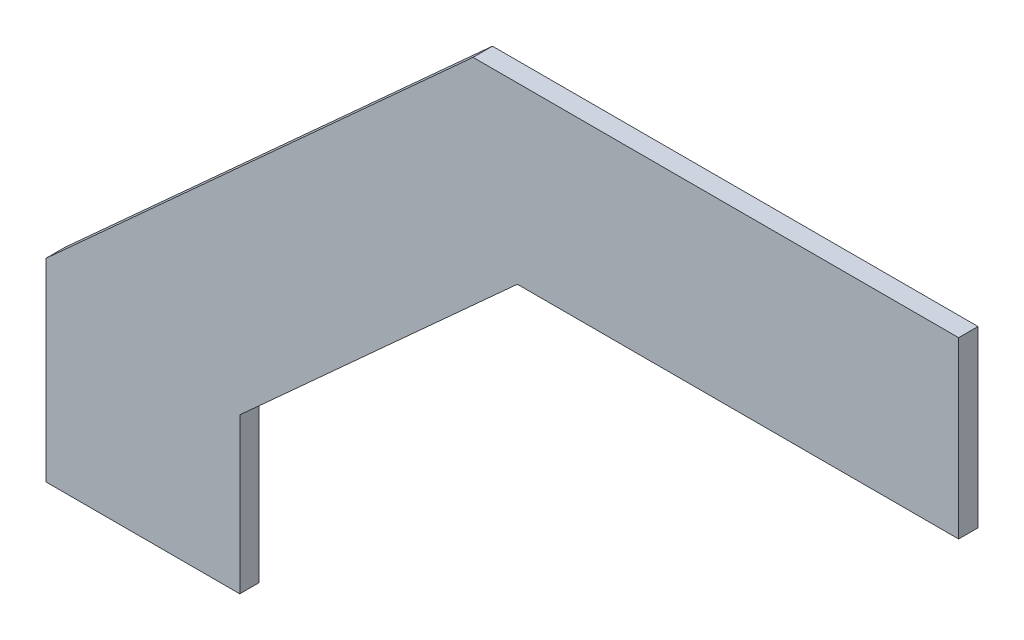
ISO-10303-21;
HEADER;
FILE_DESCRIPTION(('STEP AP214'),'2;1');
FILE_NAME('part.step','',(''),(''),'','','');
FILE_SCHEMA(('AUTOMOTIVE_DESIGN { 1 0 10303 214 1 1 1 1 }'));
ENDSEC;
DATA;
#1=APPLICATION_CONTEXT('core data for automotive mechanical design processes');
#2=APPLICATION_PROTOCOL_DEFINITION('international standard','automotive_design',2000,#1);
#3=PRODUCT_CONTEXT('',#1,'mechanical');
#4=PRODUCT('Part','Part','',(#3));
#5=PRODUCT_RELATED_PRODUCT_CATEGORY('part','',(#4));
#6=PRODUCT_DEFINITION_FORMATION('','',#4);
#7=PRODUCT_DEFINITION_CONTEXT('part definition',#1,'design');
#8=PRODUCT_DEFINITION('design','',#6,#7);
#9=PRODUCT_DEFINITION_SHAPE('','',#8);
#10=(LENGTH_UNIT() NAMED_UNIT(*) SI_UNIT(.MILLI.,.METRE.));
#11=(NAMED_UNIT(*) PLANE_ANGLE_UNIT() SI_UNIT($,.RADIAN.));
#12=(NAMED_UNIT(*) SI_UNIT($,.STERADIAN.) SOLID_ANGLE_UNIT());
#13=UNCERTAINTY_MEASURE_WITH_UNIT(LENGTH_MEASURE(1.E-05),#10,'distance_accuracy_value','');
#14=(GEOMETRIC_REPRESENTATION_CONTEXT(3) GLOBAL_UNCERTAINTY_ASSIGNED_CONTEXT((#13)) GLOBAL_UNIT_ASSIGNED_CONTEXT((#10,
#11,#12)) REPRESENTATION_CONTEXT('',''));
#15=CARTESIAN_POINT('',(0.,0.,0.));
#16=DIRECTION('',(0.,0.,1.));
#17=DIRECTION('',(1.,0.,0.));
#18=AXIS2_PLACEMENT_3D('',#15,#16,#17);
#19=CARTESIAN_POINT('',(1.,0.8,0.05));
#20=DIRECTION('',(-0.671978388271832,0.740570756711059,0.));
#21=DIRECTION('',(-0.740570756711059,-0.671978388271832,0.));
#22=AXIS2_PLACEMENT_3D('',#19,#20,#21);
#23=PLANE('',#22);
#24=DIRECTION('',(0.740570756711059,0.671978388271832,0.));
#25=VECTOR('',#24,1.);
#26=CARTESIAN_POINT('',(1.,0.8,-0.05));
#27=LINE('',#26,#25);
#28=CARTESIAN_POINT('',(1.,0.8,-0.05));
#29=VERTEX_POINT('',#28);
#30=CARTESIAN_POINT('',(2.43269783750088,2.1,-0.05));
#31=VERTEX_POINT('',#30);
#32=EDGE_CURVE('E140',#29,#31,#27,.T.);
#33=ORIENTED_EDGE('',*,*,#32,.T.);
#34=DIRECTION('',(0.,0.,-1.));
#35=VECTOR('',#34,1.);
#36=CARTESIAN_POINT('',(2.43269783750088,2.1,0.05));
#37=LINE('',#36,#35);
#38=CARTESIAN_POINT('',(2.43269783750088,2.1,0.05));
#39=VERTEX_POINT('',#38);
#40=EDGE_CURVE('E11',#39,#31,#37,.T.);
#41=ORIENTED_EDGE('',*,*,#40,.F.);
#42=DIRECTION('',(0.740570756711059,0.671978388271832,0.));
#43=VECTOR('',#42,1.);
#44=CARTESIAN_POINT('',(1.,0.8,0.05));
#45=LINE('',#44,#43);
#46=CARTESIAN_POINT('',(1.,0.8,0.05));
#47=VERTEX_POINT('',#46);
#48=EDGE_CURVE('E162',#47,#39,#45,.T.);
#49=ORIENTED_EDGE('',*,*,#48,.F.);
#50=DIRECTION('',(0.,0.,-1.));
#51=VECTOR('',#50,1.);
#52=CARTESIAN_POINT('',(1.,0.8,0.05));
#53=LINE('',#52,#51);
#54=EDGE_CURVE('E136',#47,#29,#53,.T.);
#55=ORIENTED_EDGE('',*,*,#54,.T.);
#56=EDGE_LOOP('',(#33,#41,#49,#55));
#57=FACE_BOUND('',#56,.T.);
#58=ADVANCED_FACE('F39',(#57),#23,.F.);
#59=CARTESIAN_POINT('',(2.43269783750088,2.1,0.05));
#60=DIRECTION('',(0.,1.,0.));
#61=DIRECTION('',(0.,0.,1.));
#62=AXIS2_PLACEMENT_3D('',#59,#60,#61);
#63=PLANE('',#62);
#64=DIRECTION('',(1.,0.,0.));
#65=VECTOR('',#64,1.);
#66=CARTESIAN_POINT('',(2.43269783750088,2.1,-0.05));
#67=LINE('',#66,#65);
#68=CARTESIAN_POINT('',(4.71,2.1,-0.05));
#69=VERTEX_POINT('',#68);
#70=EDGE_CURVE('E144',#31,#69,#67,.T.);
#71=ORIENTED_EDGE('',*,*,#70,.T.);
#72=DIRECTION('',(0.,0.,-1.));
#73=VECTOR('',#72,1.);
#74=CARTESIAN_POINT('',(4.71,2.1,0.05));
#75=LINE('',#74,#73);
#76=CARTESIAN_POINT('',(4.71,2.1,0.05));
#77=VERTEX_POINT('',#76);
#78=EDGE_CURVE('E48',#77,#69,#75,.T.);
#79=ORIENTED_EDGE('',*,*,#78,.F.);
#80=DIRECTION('',(1.,0.,0.));
#81=VECTOR('',#80,1.);
#82=CARTESIAN_POINT('',(2.43269783750088,2.1,0.05));
#83=LINE('',#82,#81);
#84=EDGE_CURVE('E99',#39,#77,#83,.T.);
#85=ORIENTED_EDGE('',*,*,#84,.F.);
#86=ORIENTED_EDGE('',*,*,#40,.T.);
#87=EDGE_LOOP('',(#71,#79,#85,#86));
#88=FACE_BOUND('',#87,.T.);
#89=ADVANCED_FACE('F208',(#88),#63,.F.);
#90=CARTESIAN_POINT('',(4.71,2.1,0.05));
#91=DIRECTION('',(-1.,0.,0.));
#92=DIRECTION('',(0.,0.,1.));
#93=AXIS2_PLACEMENT_3D('',#90,#91,#92);
#94=PLANE('',#93);
#95=DIRECTION('',(0.,1.,0.));
#96=VECTOR('',#95,1.);
#97=CARTESIAN_POINT('',(4.71,2.1,-0.05));
#98=LINE('',#97,#96);
#99=CARTESIAN_POINT('',(4.71,3.,-0.05));
#100=VERTEX_POINT('',#99);
#101=EDGE_CURVE('E147',#69,#100,#98,.T.);
#102=ORIENTED_EDGE('',*,*,#101,.T.);
#103=DIRECTION('',(0.,0.,-1.));
#104=VECTOR('',#103,1.);
#105=CARTESIAN_POINT('',(4.71,3.,0.05));
#106=LINE('',#105,#104);
#107=CARTESIAN_POINT('',(4.71,3.,0.05));
#108=VERTEX_POINT('',#107);
#109=EDGE_CURVE('E173',#108,#100,#106,.T.);
#110=ORIENTED_EDGE('',*,*,#109,.F.);
#111=DIRECTION('',(0.,1.,0.));
#112=VECTOR('',#111,1.);
#113=CARTESIAN_POINT('',(4.71,2.1,0.05));
#114=LINE('',#113,#112);
#115=EDGE_CURVE('E183',#77,#108,#114,.T.);
#116=ORIENTED_EDGE('',*,*,#115,.F.);
#117=ORIENTED_EDGE('',*,*,#78,.T.);
#118=EDGE_LOOP('',(#102,#110,#116,#117));
#119=FACE_BOUND('',#118,.T.);
#120=ADVANCED_FACE('F181',(#119),#94,.F.);
#121=CARTESIAN_POINT('',(4.71,3.,0.05));
#122=DIRECTION('',(0.,-1.,0.));
#123=DIRECTION('',(0.,0.,-1.));
#124=AXIS2_PLACEMENT_3D('',#121,#122,#123);
#125=PLANE('',#124);
#126=DIRECTION('',(-1.,0.,0.));
#127=VECTOR('',#126,1.);
#128=CARTESIAN_POINT('',(4.71,3.,-0.05));
#129=LINE('',#128,#127);
#130=CARTESIAN_POINT('',(2.20415051923212,3.,-0.05));
#131=VERTEX_POINT('',#130);
#132=EDGE_CURVE('E150',#100,#131,#129,.T.);
#133=ORIENTED_EDGE('',*,*,#132,.T.);
#134=DIRECTION('',(0.,0.,-1.));
#135=VECTOR('',#134,1.);
#136=CARTESIAN_POINT('',(2.20415051923212,3.,0.05));
#137=LINE('',#136,#135);
#138=CARTESIAN_POINT('',(2.20415051923212,3.,0.05));
#139=VERTEX_POINT('',#138);
#140=EDGE_CURVE('E169',#139,#131,#137,.T.);
#141=ORIENTED_EDGE('',*,*,#140,.F.);
#142=DIRECTION('',(-1.,0.,0.));
#143=VECTOR('',#142,1.);
#144=CARTESIAN_POINT('',(4.71,3.,0.05));
#145=LINE('',#144,#143);
#146=EDGE_CURVE('E196',#108,#139,#145,.T.);
#147=ORIENTED_EDGE('',*,*,#146,.F.);
#148=ORIENTED_EDGE('',*,*,#109,.T.);
#149=EDGE_LOOP('',(#133,#141,#147,#148));
#150=FACE_BOUND('',#149,.T.);
#151=ADVANCED_FACE('F191',(#150),#125,.F.);
#152=CARTESIAN_POINT('',(2.20415051923212,3.,0.05));
#153=DIRECTION('',(0.671978388271832,-0.740570756711059,0.));
#154=DIRECTION('',(0.740570756711059,0.671978388271832,0.));
#155=AXIS2_PLACEMENT_3D('',#152,#153,#154);
#156=PLANE('',#155);
#157=DIRECTION('',(-0.740570756711059,-0.671978388271832,0.));
#158=VECTOR('',#157,1.);
#159=CARTESIAN_POINT('',(2.20415051923212,3.,-0.05));
#160=LINE('',#159,#158);
#161=CARTESIAN_POINT('',(0.,1.,-0.05));
#162=VERTEX_POINT('',#161);
#163=EDGE_CURVE('E153',#131,#162,#160,.T.);
#164=ORIENTED_EDGE('',*,*,#163,.T.);
#165=DIRECTION('',(0.,0.,-1.));
#166=VECTOR('',#165,1.);
#167=CARTESIAN_POINT('',(0.,1.,0.05));
#168=LINE('',#167,#166);
#169=CARTESIAN_POINT('',(0.,1.,0.05));
#170=VERTEX_POINT('',#169);
#171=EDGE_CURVE('E129',#170,#162,#168,.T.);
#172=ORIENTED_EDGE('',*,*,#171,.F.);
#173=DIRECTION('',(-0.740570756711059,-0.671978388271832,0.));
#174=VECTOR('',#173,1.);
#175=CARTESIAN_POINT('',(2.20415051923212,3.,0.05));
#176=LINE('',#175,#174);
#177=EDGE_CURVE('E118',#139,#170,#176,.T.);
#178=ORIENTED_EDGE('',*,*,#177,.F.);
#179=ORIENTED_EDGE('',*,*,#140,.T.);
#180=EDGE_LOOP('',(#164,#172,#178,#179));
#181=FACE_BOUND('',#180,.T.);
#182=ADVANCED_FACE('F194',(#181),#156,.F.);
#183=CARTESIAN_POINT('',(0.,1.,0.05));
#184=DIRECTION('',(1.,0.,0.));
#185=DIRECTION('',(0.,1.,0.));
#186=AXIS2_PLACEMENT_3D('',#183,#184,#185);
#187=PLANE('',#186);
#188=DIRECTION('',(0.,-1.,0.));
#189=VECTOR('',#188,1.);
#190=CARTESIAN_POINT('',(0.,1.,-0.05));
#191=LINE('',#190,#189);
#192=CARTESIAN_POINT('',(0.,0.,-0.05));
#193=VERTEX_POINT('',#192);
#194=EDGE_CURVE('E127',#162,#193,#191,.T.);
#195=ORIENTED_EDGE('',*,*,#194,.T.);
#196=DIRECTION('',(0.,0.,-1.));
#197=VECTOR('',#196,1.);
#198=CARTESIAN_POINT('',(0.,0.,0.05));
#199=LINE('',#198,#197);
#200=CARTESIAN_POINT('',(0.,0.,0.05));
#201=VERTEX_POINT('',#200);
#202=EDGE_CURVE('E124',#201,#193,#199,.T.);
#203=ORIENTED_EDGE('',*,*,#202,.F.);
#204=DIRECTION('',(0.,-1.,0.));
#205=VECTOR('',#204,1.);
#206=CARTESIAN_POINT('',(0.,1.,0.05));
#207=LINE('',#206,#205);
#208=EDGE_CURVE('E112',#170,#201,#207,.T.);
#209=ORIENTED_EDGE('',*,*,#208,.F.);
#210=ORIENTED_EDGE('',*,*,#171,.T.);
#211=EDGE_LOOP('',(#195,#203,#209,#210));
#212=FACE_BOUND('',#211,.T.);
#213=ADVANCED_FACE('F125',(#212),#187,.F.);
#214=CARTESIAN_POINT('',(0.,0.,0.05));
#215=DIRECTION('',(0.,1.,0.));
#216=DIRECTION('',(0.,0.,1.));
#217=AXIS2_PLACEMENT_3D('',#214,#215,#216);
#218=PLANE('',#217);
#219=DIRECTION('',(1.,0.,0.));
#220=VECTOR('',#219,1.);
#221=CARTESIAN_POINT('',(0.,0.,-0.05));
#222=LINE('',#221,#220);
#223=CARTESIAN_POINT('',(1.,0.,-0.05));
#224=VERTEX_POINT('',#223);
#225=EDGE_CURVE('E85',#193,#224,#222,.T.);
#226=ORIENTED_EDGE('',*,*,#225,.T.);
#227=DIRECTION('',(0.,0.,-1.));
#228=VECTOR('',#227,1.);
#229=CARTESIAN_POINT('',(1.,0.,0.05));
#230=LINE('',#229,#228);
#231=CARTESIAN_POINT('',(1.,0.,0.05));
#232=VERTEX_POINT('',#231);
#233=EDGE_CURVE('E130',#232,#224,#230,.T.);
#234=ORIENTED_EDGE('',*,*,#233,.F.);
#235=DIRECTION('',(1.,0.,0.));
#236=VECTOR('',#235,1.);
#237=CARTESIAN_POINT('',(0.,0.,0.05));
#238=LINE('',#237,#236);
#239=EDGE_CURVE('E116',#201,#232,#238,.T.);
#240=ORIENTED_EDGE('',*,*,#239,.F.);
#241=ORIENTED_EDGE('',*,*,#202,.T.);
#242=EDGE_LOOP('',(#226,#234,#240,#241));
#243=FACE_BOUND('',#242,.T.);
#244=ADVANCED_FACE('F132',(#243),#218,.F.);
#245=CARTESIAN_POINT('',(1.,0.,0.05));
#246=DIRECTION('',(-1.,0.,0.));
#247=DIRECTION('',(0.,-1.,0.));
#248=AXIS2_PLACEMENT_3D('',#245,#246,#247);
#249=PLANE('',#248);
#250=DIRECTION('',(0.,1.,0.));
#251=VECTOR('',#250,1.);
#252=CARTESIAN_POINT('',(1.,0.,-0.05));
#253=LINE('',#252,#251);
#254=EDGE_CURVE('E91',#224,#29,#253,.T.);
#255=ORIENTED_EDGE('',*,*,#254,.T.);
#256=ORIENTED_EDGE('',*,*,#54,.F.);
#257=DIRECTION('',(0.,1.,0.));
#258=VECTOR('',#257,1.);
#259=CARTESIAN_POINT('',(1.,0.,0.05));
#260=LINE('',#259,#258);
#261=EDGE_CURVE('E56',#232,#47,#260,.T.);
#262=ORIENTED_EDGE('',*,*,#261,.F.);
#263=ORIENTED_EDGE('',*,*,#233,.T.);
#264=EDGE_LOOP('',(#255,#256,#262,#263));
#265=FACE_BOUND('',#264,.T.);
#266=ADVANCED_FACE('F224',(#265),#249,.F.);
#267=CARTESIAN_POINT('',(0.,0.,0.05));
#268=DIRECTION('',(0.,0.,1.));
#269=DIRECTION('',(1.,0.,0.));
#270=AXIS2_PLACEMENT_3D('',#267,#268,#269);
#271=PLANE('',#270);
#272=ORIENTED_EDGE('',*,*,#48,.T.);
#273=ORIENTED_EDGE('',*,*,#84,.T.);
#274=ORIENTED_EDGE('',*,*,#115,.T.);
#275=ORIENTED_EDGE('',*,*,#146,.T.);
#276=ORIENTED_EDGE('',*,*,#177,.T.);
#277=ORIENTED_EDGE('',*,*,#208,.T.);
#278=ORIENTED_EDGE('',*,*,#239,.T.);
#279=ORIENTED_EDGE('',*,*,#261,.T.);
#280=EDGE_LOOP('',(#272,#273,#274,#275,#276,#277,#278,#279));
#281=FACE_BOUND('',#280,.T.);
#282=ADVANCED_FACE('F114',(#281),#271,.T.);
#283=CARTESIAN_POINT('',(0.,0.,-0.05));
#284=DIRECTION('',(0.,0.,1.));
#285=DIRECTION('',(1.,0.,0.));
#286=AXIS2_PLACEMENT_3D('',#283,#284,#285);
#287=PLANE('',#286);
#288=ORIENTED_EDGE('',*,*,#32,.F.);
#289=ORIENTED_EDGE('',*,*,#254,.F.);
#290=ORIENTED_EDGE('',*,*,#225,.F.);
#291=ORIENTED_EDGE('',*,*,#194,.F.);
#292=ORIENTED_EDGE('',*,*,#163,.F.);
#293=ORIENTED_EDGE('',*,*,#132,.F.);
#294=ORIENTED_EDGE('',*,*,#101,.F.);
#295=ORIENTED_EDGE('',*,*,#70,.F.);
#296=EDGE_LOOP('',(#288,#289,#290,#291,#292,#293,#294,#295));
#297=FACE_BOUND('',#296,.T.);
#298=ADVANCED_FACE('F187',(#297),#287,.F.);
#299=CLOSED_SHELL('',(#58,#89,#120,#151,#182,#213,#244,#266,#282,#298));
#300=MANIFOLD_SOLID_BREP('B2',#299);
#301=ADVANCED_BREP_SHAPE_REPRESENTATION('',(#18,#300),#14);
#302=SHAPE_DEFINITION_REPRESENTATION(#9,#301);
ENDSEC;
END-ISO-10303-21;
